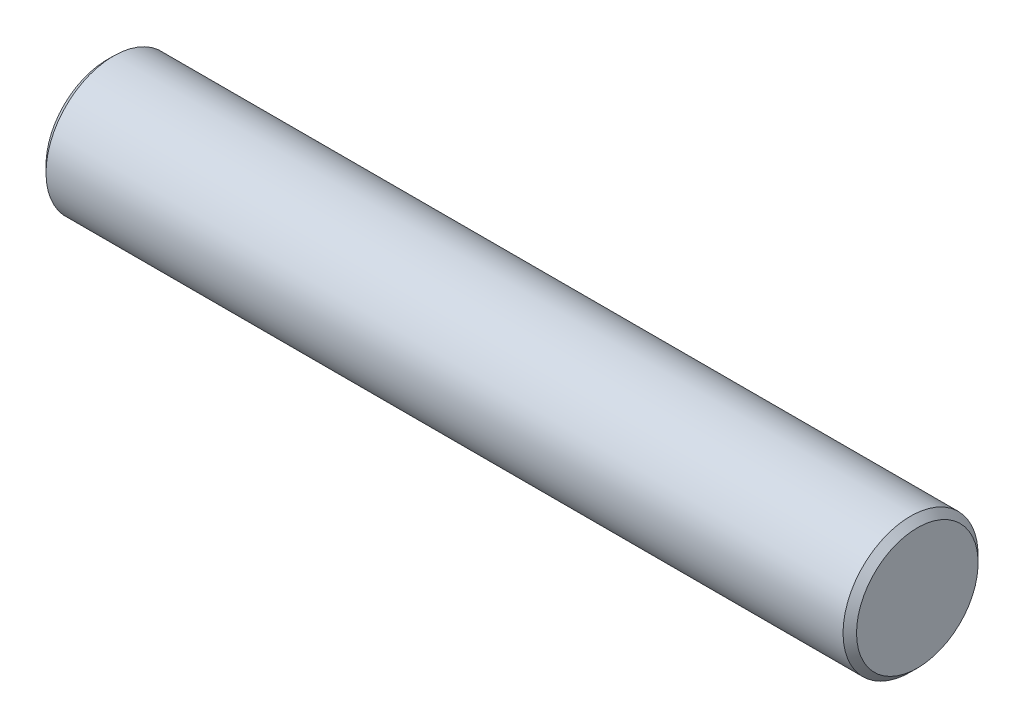
ISO-10303-21;
HEADER;
FILE_DESCRIPTION(('STEP AP214'),'2;1');
FILE_NAME('part.step','',(''),(''),'','','');
FILE_SCHEMA(('AUTOMOTIVE_DESIGN { 1 0 10303 214 1 1 1 1 }'));
ENDSEC;
DATA;
#1=APPLICATION_CONTEXT('core data for automotive mechanical design processes');
#2=APPLICATION_PROTOCOL_DEFINITION('international standard','automotive_design',2000,#1);
#3=PRODUCT_CONTEXT('',#1,'mechanical');
#4=PRODUCT('Part','Part','',(#3));
#5=PRODUCT_RELATED_PRODUCT_CATEGORY('part','',(#4));
#6=PRODUCT_DEFINITION_FORMATION('','',#4);
#7=PRODUCT_DEFINITION_CONTEXT('part definition',#1,'design');
#8=PRODUCT_DEFINITION('design','',#6,#7);
#9=PRODUCT_DEFINITION_SHAPE('','',#8);
#10=(LENGTH_UNIT() NAMED_UNIT(*) SI_UNIT(.MILLI.,.METRE.));
#11=(NAMED_UNIT(*) PLANE_ANGLE_UNIT() SI_UNIT($,.RADIAN.));
#12=(NAMED_UNIT(*) SI_UNIT($,.STERADIAN.) SOLID_ANGLE_UNIT());
#13=UNCERTAINTY_MEASURE_WITH_UNIT(LENGTH_MEASURE(1.E-05),#10,'distance_accuracy_value','');
#14=(GEOMETRIC_REPRESENTATION_CONTEXT(3) GLOBAL_UNCERTAINTY_ASSIGNED_CONTEXT((#13)) GLOBAL_UNIT_ASSIGNED_CONTEXT((#10,
#11,#12)) REPRESENTATION_CONTEXT('',''));
#15=CARTESIAN_POINT('',(0.,0.,0.));
#16=DIRECTION('',(0.,0.,1.));
#17=DIRECTION('',(1.,0.,0.));
#18=AXIS2_PLACEMENT_3D('',#15,#16,#17);
#19=CARTESIAN_POINT('',(0.,5.,0.));
#20=DIRECTION('',(1.,0.,0.));
#21=DIRECTION('',(0.,0.,-1.));
#22=AXIS2_PLACEMENT_3D('',#19,#20,#21);
#23=PLANE('',#22);
#24=CARTESIAN_POINT('',(0.,0.,0.));
#25=DIRECTION('',(1.,0.,0.));
#26=DIRECTION('',(0.,0.,-1.));
#27=AXIS2_PLACEMENT_3D('',#24,#25,#26);
#28=CIRCLE('',#27,4.49999999999999);
#29=CARTESIAN_POINT('',(0.,0.,-4.49999999999999));
#30=VERTEX_POINT('',#29);
#31=EDGE_CURVE('E52',#30,#30,#28,.F.);
#32=ORIENTED_EDGE('',*,*,#31,.T.);
#33=EDGE_LOOP('',(#32));
#34=FACE_BOUND('',#33,.T.);
#35=ADVANCED_FACE('F37',(#34),#23,.F.);
#36=CARTESIAN_POINT('',(60.,0.,0.));
#37=DIRECTION('',(-1.,0.,0.));
#38=DIRECTION('',(0.,0.,1.));
#39=AXIS2_PLACEMENT_3D('',#36,#37,#38);
#40=PLANE('',#39);
#41=CARTESIAN_POINT('',(60.,0.,0.));
#42=DIRECTION('',(-1.,0.,0.));
#43=DIRECTION('',(0.,0.,1.));
#44=AXIS2_PLACEMENT_3D('',#41,#42,#43);
#45=CIRCLE('',#44,4.50000000000001);
#46=CARTESIAN_POINT('',(60.,0.,4.50000000000001));
#47=VERTEX_POINT('',#46);
#48=EDGE_CURVE('E10',#47,#47,#45,.F.);
#49=ORIENTED_EDGE('',*,*,#48,.T.);
#50=EDGE_LOOP('',(#49));
#51=FACE_BOUND('',#50,.T.);
#52=ADVANCED_FACE('F68',(#51),#40,.F.);
#53=CARTESIAN_POINT('',(0.,0.,0.));
#54=DIRECTION('',(-1.,0.,0.));
#55=DIRECTION('',(0.,0.,1.));
#56=AXIS2_PLACEMENT_3D('',#53,#54,#55);
#57=CYLINDRICAL_SURFACE('',#56,5.);
#58=CARTESIAN_POINT('',(0.500000000000007,0.,0.));
#59=DIRECTION('',(1.,0.,0.));
#60=DIRECTION('',(0.,0.,-1.));
#61=AXIS2_PLACEMENT_3D('',#58,#59,#60);
#62=CIRCLE('',#61,5.);
#63=CARTESIAN_POINT('',(0.500000000000007,0.,-5.));
#64=VERTEX_POINT('',#63);
#65=EDGE_CURVE('E44',#64,#64,#62,.T.);
#66=ORIENTED_EDGE('',*,*,#65,.T.);
#67=EDGE_LOOP('',(#66));
#68=FACE_BOUND('',#67,.T.);
#69=CARTESIAN_POINT('',(59.5,0.,0.));
#70=DIRECTION('',(-1.,0.,0.));
#71=DIRECTION('',(0.,0.,1.));
#72=AXIS2_PLACEMENT_3D('',#69,#70,#71);
#73=CIRCLE('',#72,5.);
#74=CARTESIAN_POINT('',(59.5,0.,5.));
#75=VERTEX_POINT('',#74);
#76=EDGE_CURVE('E48',#75,#75,#73,.T.);
#77=ORIENTED_EDGE('',*,*,#76,.T.);
#78=EDGE_LOOP('',(#77));
#79=FACE_BOUND('',#78,.T.);
#80=ADVANCED_FACE('F61',(#68,#79),#57,.T.);
#81=CARTESIAN_POINT('',(0.,0.,0.));
#82=DIRECTION('',(1.,0.,0.));
#83=DIRECTION('',(0.,0.,-1.));
#84=AXIS2_PLACEMENT_3D('',#81,#82,#83);
#85=CONICAL_SURFACE('',#84,4.49999999999999,0.785398163397452);
#86=ORIENTED_EDGE('',*,*,#65,.F.);
#87=EDGE_LOOP('',(#86));
#88=FACE_BOUND('',#87,.T.);
#89=ORIENTED_EDGE('',*,*,#31,.F.);
#90=EDGE_LOOP('',(#89));
#91=FACE_BOUND('',#90,.T.);
#92=ADVANCED_FACE('F59',(#88,#91),#85,.T.);
#93=CARTESIAN_POINT('',(59.5,0.,0.));
#94=DIRECTION('',(-1.,0.,0.));
#95=DIRECTION('',(0.,0.,1.));
#96=AXIS2_PLACEMENT_3D('',#93,#94,#95);
#97=CONICAL_SURFACE('',#96,5.,0.785398163397438);
#98=ORIENTED_EDGE('',*,*,#48,.F.);
#99=EDGE_LOOP('',(#98));
#100=FACE_BOUND('',#99,.T.);
#101=ORIENTED_EDGE('',*,*,#76,.F.);
#102=EDGE_LOOP('',(#101));
#103=FACE_BOUND('',#102,.T.);
#104=ADVANCED_FACE('F39',(#100,#103),#97,.T.);
#105=CLOSED_SHELL('',(#35,#52,#80,#92,#104));
#106=MANIFOLD_SOLID_BREP('B2',#105);
#107=ADVANCED_BREP_SHAPE_REPRESENTATION('',(#18,#106),#14);
#108=SHAPE_DEFINITION_REPRESENTATION(#9,#107);
ENDSEC;
END-ISO-10303-21;
